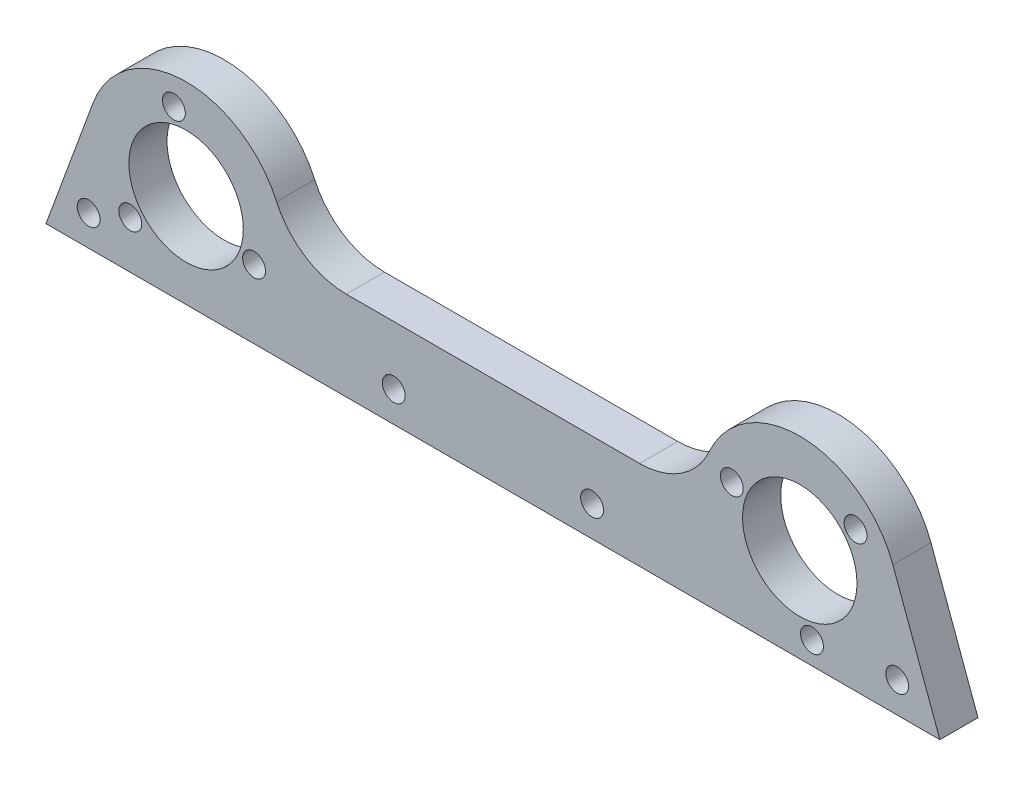
ISO-10303-21;
HEADER;
FILE_DESCRIPTION(('STEP AP214'),'2;1');
FILE_NAME('part.step','',(''),(''),'','','');
FILE_SCHEMA(('AUTOMOTIVE_DESIGN { 1 0 10303 214 1 1 1 1 }'));
ENDSEC;
DATA;
#1=APPLICATION_CONTEXT('core data for automotive mechanical design processes');
#2=APPLICATION_PROTOCOL_DEFINITION('international standard','automotive_design',2000,#1);
#3=PRODUCT_CONTEXT('',#1,'mechanical');
#4=PRODUCT('Part','Part','',(#3));
#5=PRODUCT_RELATED_PRODUCT_CATEGORY('part','',(#4));
#6=PRODUCT_DEFINITION_FORMATION('','',#4);
#7=PRODUCT_DEFINITION_CONTEXT('part definition',#1,'design');
#8=PRODUCT_DEFINITION('design','',#6,#7);
#9=PRODUCT_DEFINITION_SHAPE('','',#8);
#10=(LENGTH_UNIT() NAMED_UNIT(*) SI_UNIT(.MILLI.,.METRE.));
#11=(NAMED_UNIT(*) PLANE_ANGLE_UNIT() SI_UNIT($,.RADIAN.));
#12=(NAMED_UNIT(*) SI_UNIT($,.STERADIAN.) SOLID_ANGLE_UNIT());
#13=UNCERTAINTY_MEASURE_WITH_UNIT(LENGTH_MEASURE(1.E-05),#10,'distance_accuracy_value','');
#14=(GEOMETRIC_REPRESENTATION_CONTEXT(3) GLOBAL_UNCERTAINTY_ASSIGNED_CONTEXT((#13)) GLOBAL_UNIT_ASSIGNED_CONTEXT((#10,
#11,#12)) REPRESENTATION_CONTEXT('',''));
#15=CARTESIAN_POINT('',(0.,0.,0.));
#16=DIRECTION('',(0.,0.,1.));
#17=DIRECTION('',(1.,0.,0.));
#18=AXIS2_PLACEMENT_3D('',#15,#16,#17);
#19=CARTESIAN_POINT('',(-18.3632322296883,0.,3.75));
#20=DIRECTION('',(0.938751597235836,-0.344594600490442,0.));
#21=DIRECTION('',(0.344594600490442,0.938751597235836,0.));
#22=AXIS2_PLACEMENT_3D('',#19,#20,#21);
#23=PLANE('',#22);
#24=DIRECTION('',(-0.344594600490442,-0.938751597235836,0.));
#25=VECTOR('',#24,1.);
#26=CARTESIAN_POINT('',(-18.3632322296883,0.,-1.25));
#27=LINE('',#26,#25);
#28=CARTESIAN_POINT('',(-12.2037707640659,16.7797298063758,-1.25));
#29=VERTEX_POINT('',#28);
#30=CARTESIAN_POINT('',(-18.3632322296883,0.,-1.25));
#31=VERTEX_POINT('',#30);
#32=EDGE_CURVE('E145',#29,#31,#27,.T.);
#33=ORIENTED_EDGE('',*,*,#32,.T.);
#34=DIRECTION('',(0.,0.,-1.));
#35=VECTOR('',#34,1.);
#36=CARTESIAN_POINT('',(-18.3632322296883,0.,3.75));
#37=LINE('',#36,#35);
#38=CARTESIAN_POINT('',(-18.3632322296883,0.,3.75));
#39=VERTEX_POINT('',#38);
#40=EDGE_CURVE('E158',#39,#31,#37,.T.);
#41=ORIENTED_EDGE('',*,*,#40,.F.);
#42=DIRECTION('',(-0.344594600490442,-0.938751597235836,0.));
#43=VECTOR('',#42,1.);
#44=CARTESIAN_POINT('',(-18.3632322296883,0.,3.75));
#45=LINE('',#44,#43);
#46=CARTESIAN_POINT('',(-12.2037707640659,16.7797298063758,3.75));
#47=VERTEX_POINT('',#46);
#48=EDGE_CURVE('E107',#47,#39,#45,.T.);
#49=ORIENTED_EDGE('',*,*,#48,.F.);
#50=DIRECTION('',(0.,0.,-1.));
#51=VECTOR('',#50,1.);
#52=CARTESIAN_POINT('',(-12.2037707640659,16.7797298063758,3.75));
#53=LINE('',#52,#51);
#54=EDGE_CURVE('E151',#47,#29,#53,.T.);
#55=ORIENTED_EDGE('',*,*,#54,.T.);
#56=EDGE_LOOP('',(#33,#41,#49,#55));
#57=FACE_BOUND('',#56,.T.);
#58=ADVANCED_FACE('F35',(#57),#23,.F.);
#59=CARTESIAN_POINT('',(-18.3632322296883,0.,3.75));
#60=DIRECTION('',(0.,1.,0.));
#61=DIRECTION('',(0.,0.,1.));
#62=AXIS2_PLACEMENT_3D('',#59,#60,#61);
#63=PLANE('',#62);
#64=DIRECTION('',(0.,0.,-1.));
#65=VECTOR('',#64,1.);
#66=CARTESIAN_POINT('',(98.8132322296883,0.,3.75));
#67=LINE('',#66,#65);
#68=CARTESIAN_POINT('',(98.8132322296883,0.,3.75));
#69=VERTEX_POINT('',#68);
#70=CARTESIAN_POINT('',(98.8132322296883,0.,-1.25));
#71=VERTEX_POINT('',#70);
#72=EDGE_CURVE('E114',#69,#71,#67,.T.);
#73=ORIENTED_EDGE('',*,*,#72,.F.);
#74=DIRECTION('',(1.,0.,0.));
#75=VECTOR('',#74,1.);
#76=CARTESIAN_POINT('',(-18.3632322296883,0.,3.75));
#77=LINE('',#76,#75);
#78=EDGE_CURVE('E99',#39,#69,#77,.T.);
#79=ORIENTED_EDGE('',*,*,#78,.F.);
#80=ORIENTED_EDGE('',*,*,#40,.T.);
#81=DIRECTION('',(1.,0.,0.));
#82=VECTOR('',#81,1.);
#83=CARTESIAN_POINT('',(-18.3632322296883,0.,-1.25));
#84=LINE('',#83,#82);
#85=EDGE_CURVE('E116',#31,#71,#84,.T.);
#86=ORIENTED_EDGE('',*,*,#85,.T.);
#87=EDGE_LOOP('',(#73,#79,#80,#86));
#88=FACE_BOUND('',#87,.T.);
#89=ADVANCED_FACE('F115',(#88),#63,.F.);
#90=CARTESIAN_POINT('',(0.,12.3,3.75));
#91=DIRECTION('',(0.,0.,-1.));
#92=DIRECTION('',(-1.,0.,0.));
#93=AXIS2_PLACEMENT_3D('',#90,#91,#92);
#94=CYLINDRICAL_SURFACE('',#93,13.);
#95=CARTESIAN_POINT('',(0.,12.3,3.75));
#96=DIRECTION('',(0.,0.,1.));
#97=DIRECTION('',(1.,0.,0.));
#98=AXIS2_PLACEMENT_3D('',#95,#96,#97);
#99=CIRCLE('',#98,13.);
#100=CARTESIAN_POINT('',(11.8684813075359,17.604634902863,3.75));
#101=VERTEX_POINT('',#100);
#102=EDGE_CURVE('E111',#101,#47,#99,.T.);
#103=ORIENTED_EDGE('',*,*,#102,.F.);
#104=DIRECTION('',(0.,0.,-1.));
#105=VECTOR('',#104,1.);
#106=CARTESIAN_POINT('',(11.8684813075359,17.604634902863,3.75));
#107=LINE('',#106,#105);
#108=CARTESIAN_POINT('',(11.8684813075359,17.604634902863,-1.25));
#109=VERTEX_POINT('',#108);
#110=EDGE_CURVE('E160',#101,#109,#107,.T.);
#111=ORIENTED_EDGE('',*,*,#110,.T.);
#112=CARTESIAN_POINT('',(0.,12.3,-1.25));
#113=DIRECTION('',(0.,0.,1.));
#114=DIRECTION('',(1.,0.,0.));
#115=AXIS2_PLACEMENT_3D('',#112,#113,#114);
#116=CIRCLE('',#115,13.);
#117=EDGE_CURVE('E148',#109,#29,#116,.T.);
#118=ORIENTED_EDGE('',*,*,#117,.T.);
#119=ORIENTED_EDGE('',*,*,#54,.F.);
#120=EDGE_LOOP('',(#103,#111,#118,#119));
#121=FACE_BOUND('',#120,.T.);
#122=ADVANCED_FACE('F180',(#121),#94,.T.);
#123=CARTESIAN_POINT('',(0.,12.3,3.75));
#124=DIRECTION('',(0.,0.,1.));
#125=DIRECTION('',(1.,0.,0.));
#126=AXIS2_PLACEMENT_3D('',#123,#124,#125);
#127=PLANE('',#126);
#128=CARTESIAN_POINT('',(93.225,3.99999999999998,3.75));
#129=DIRECTION('',(0.,0.,-1.));
#130=DIRECTION('',(-1.,0.,0.));
#131=AXIS2_PLACEMENT_3D('',#128,#129,#130);
#132=CIRCLE('',#131,1.5);
#133=CARTESIAN_POINT('',(91.725,3.99999999999998,3.75));
#134=VERTEX_POINT('',#133);
#135=EDGE_CURVE('E383',#134,#134,#132,.T.);
#136=ORIENTED_EDGE('',*,*,#135,.T.);
#137=EDGE_LOOP('',(#136));
#138=FACE_BOUND('',#137,.T.);
#139=CARTESIAN_POINT('',(27.225,3.99999999999998,3.75));
#140=DIRECTION('',(0.,0.,-1.));
#141=DIRECTION('',(1.,0.,0.));
#142=AXIS2_PLACEMENT_3D('',#139,#140,#141);
#143=CIRCLE('',#142,1.5);
#144=CARTESIAN_POINT('',(28.725,3.99999999999998,3.75));
#145=VERTEX_POINT('',#144);
#146=EDGE_CURVE('E395',#145,#145,#143,.T.);
#147=ORIENTED_EDGE('',*,*,#146,.T.);
#148=EDGE_LOOP('',(#147));
#149=FACE_BOUND('',#148,.T.);
#150=CARTESIAN_POINT('',(-12.775,3.99999999999999,3.75));
#151=DIRECTION('',(0.,0.,-1.));
#152=DIRECTION('',(1.,0.,0.));
#153=AXIS2_PLACEMENT_3D('',#150,#151,#152);
#154=CIRCLE('',#153,1.5);
#155=CARTESIAN_POINT('',(-11.275,3.99999999999999,3.75));
#156=VERTEX_POINT('',#155);
#157=EDGE_CURVE('E404',#156,#156,#154,.T.);
#158=ORIENTED_EDGE('',*,*,#157,.T.);
#159=EDGE_LOOP('',(#158));
#160=FACE_BOUND('',#159,.T.);
#161=CARTESIAN_POINT('',(53.225,3.99999999999998,3.75));
#162=DIRECTION('',(0.,0.,-1.));
#163=DIRECTION('',(-1.,0.,0.));
#164=AXIS2_PLACEMENT_3D('',#161,#162,#163);
#165=CIRCLE('',#164,1.5);
#166=CARTESIAN_POINT('',(51.725,3.99999999999998,3.75));
#167=VERTEX_POINT('',#166);
#168=EDGE_CURVE('E387',#167,#167,#165,.T.);
#169=ORIENTED_EDGE('',*,*,#168,.T.);
#170=EDGE_LOOP('',(#169));
#171=FACE_BOUND('',#170,.T.);
#172=CARTESIAN_POINT('',(-1.59841444419239,21.6645646596407,3.75));
#173=DIRECTION('',(0.,0.,-1.));
#174=DIRECTION('',(-1.,0.,0.));
#175=AXIS2_PLACEMENT_3D('',#172,#173,#174);
#176=CIRCLE('',#175,1.5);
#177=CARTESIAN_POINT('',(-3.09841444419239,21.6645646596407,3.75));
#178=VERTEX_POINT('',#177);
#179=EDGE_CURVE('E409',#178,#178,#176,.T.);
#180=ORIENTED_EDGE('',*,*,#179,.T.);
#181=EDGE_LOOP('',(#180));
#182=FACE_BOUND('',#181,.T.);
#183=CARTESIAN_POINT('',(-7.31074366853484,6.23345015573269,3.75));
#184=DIRECTION('',(0.,0.,-1.));
#185=DIRECTION('',(-1.,0.,0.));
#186=AXIS2_PLACEMENT_3D('',#183,#184,#185);
#187=CIRCLE('',#186,1.5);
#188=CARTESIAN_POINT('',(-8.81074366853484,6.23345015573269,3.75));
#189=VERTEX_POINT('',#188);
#190=EDGE_CURVE('E415',#189,#189,#187,.T.);
#191=ORIENTED_EDGE('',*,*,#190,.T.);
#192=EDGE_LOOP('',(#191));
#193=FACE_BOUND('',#192,.T.);
#194=CARTESIAN_POINT('',(8.90915811272735,9.00198518462588,3.75));
#195=DIRECTION('',(0.,0.,-1.));
#196=DIRECTION('',(-1.,0.,0.));
#197=AXIS2_PLACEMENT_3D('',#194,#195,#196);
#198=CIRCLE('',#197,1.5);
#199=CARTESIAN_POINT('',(7.40915811272735,9.00198518462588,3.75));
#200=VERTEX_POINT('',#199);
#201=EDGE_CURVE('E421',#200,#200,#198,.T.);
#202=ORIENTED_EDGE('',*,*,#201,.T.);
#203=EDGE_LOOP('',(#202));
#204=FACE_BOUND('',#203,.T.);
#205=CARTESIAN_POINT('',(71.5408418872726,15.5980148153741,3.75));
#206=DIRECTION('',(0.,0.,-1.));
#207=DIRECTION('',(-1.,0.,0.));
#208=AXIS2_PLACEMENT_3D('',#205,#206,#207);
#209=CIRCLE('',#208,1.5);
#210=CARTESIAN_POINT('',(70.0408418872726,15.5980148153741,3.75));
#211=VERTEX_POINT('',#210);
#212=EDGE_CURVE('E427',#211,#211,#209,.T.);
#213=ORIENTED_EDGE('',*,*,#212,.T.);
#214=EDGE_LOOP('',(#213));
#215=FACE_BOUND('',#214,.T.);
#216=CARTESIAN_POINT('',(82.0484144441923,2.93543534035925,3.75));
#217=DIRECTION('',(0.,0.,-1.));
#218=DIRECTION('',(-1.,0.,0.));
#219=AXIS2_PLACEMENT_3D('',#216,#217,#218);
#220=CIRCLE('',#219,1.5);
#221=CARTESIAN_POINT('',(80.5484144441923,2.93543534035925,3.75));
#222=VERTEX_POINT('',#221);
#223=EDGE_CURVE('E433',#222,#222,#220,.T.);
#224=ORIENTED_EDGE('',*,*,#223,.T.);
#225=EDGE_LOOP('',(#224));
#226=FACE_BOUND('',#225,.T.);
#227=CARTESIAN_POINT('',(87.7607436685348,18.3665498442673,3.75));
#228=DIRECTION('',(0.,0.,-1.));
#229=DIRECTION('',(-1.,0.,0.));
#230=AXIS2_PLACEMENT_3D('',#227,#228,#229);
#231=CIRCLE('',#230,1.5);
#232=CARTESIAN_POINT('',(86.2607436685348,18.3665498442673,3.75));
#233=VERTEX_POINT('',#232);
#234=EDGE_CURVE('E439',#233,#233,#231,.T.);
#235=ORIENTED_EDGE('',*,*,#234,.T.);
#236=EDGE_LOOP('',(#235));
#237=FACE_BOUND('',#236,.T.);
#238=CARTESIAN_POINT('',(80.45,12.3,3.75));
#239=DIRECTION('',(0.,0.,1.));
#240=DIRECTION('',(1.,0.,0.));
#241=AXIS2_PLACEMENT_3D('',#238,#239,#240);
#242=CIRCLE('',#241,13.);
#243=CARTESIAN_POINT('',(92.6537707640659,16.7797298063758,3.75));
#244=VERTEX_POINT('',#243);
#245=CARTESIAN_POINT('',(68.5815186924641,17.604634902863,3.75));
#246=VERTEX_POINT('',#245);
#247=EDGE_CURVE('E124',#244,#246,#242,.T.);
#248=ORIENTED_EDGE('',*,*,#247,.T.);
#249=CARTESIAN_POINT('',(59.4519176866673,21.6851232896806,3.75));
#250=DIRECTION('',(0.,0.,1.));
#251=DIRECTION('',(1.,0.,0.));
#252=AXIS2_PLACEMENT_3D('',#249,#250,#251);
#253=CIRCLE('',#252,10.);
#254=CARTESIAN_POINT('',(59.4519176866673,11.6851232896806,3.75));
#255=VERTEX_POINT('',#254);
#256=EDGE_CURVE('E11',#246,#255,#253,.F.);
#257=ORIENTED_EDGE('',*,*,#256,.T.);
#258=DIRECTION('',(1.,0.,0.));
#259=VECTOR('',#258,1.);
#260=CARTESIAN_POINT('',(14.0738862476995,11.6851232896806,3.75));
#261=LINE('',#260,#259);
#262=CARTESIAN_POINT('',(20.9980823133327,11.6851232896806,3.75));
#263=VERTEX_POINT('',#262);
#264=EDGE_CURVE('E138',#263,#255,#261,.T.);
#265=ORIENTED_EDGE('',*,*,#264,.F.);
#266=CARTESIAN_POINT('',(20.9980823133327,21.6851232896806,3.75));
#267=DIRECTION('',(0.,0.,1.));
#268=DIRECTION('',(1.,0.,0.));
#269=AXIS2_PLACEMENT_3D('',#266,#267,#268);
#270=CIRCLE('',#269,10.);
#271=EDGE_CURVE('E171',#263,#101,#270,.F.);
#272=ORIENTED_EDGE('',*,*,#271,.T.);
#273=ORIENTED_EDGE('',*,*,#102,.T.);
#274=ORIENTED_EDGE('',*,*,#48,.T.);
#275=ORIENTED_EDGE('',*,*,#78,.T.);
#276=DIRECTION('',(-0.344594600490442,0.938751597235836,0.));
#277=VECTOR('',#276,1.);
#278=CARTESIAN_POINT('',(92.6537707640659,16.7797298063758,3.75));
#279=LINE('',#278,#277);
#280=EDGE_CURVE('E104',#69,#244,#279,.T.);
#281=ORIENTED_EDGE('',*,*,#280,.T.);
#282=EDGE_LOOP('',(#248,#257,#265,#272,#273,#274,#275,#281));
#283=FACE_BOUND('',#282,.T.);
#284=CARTESIAN_POINT('',(80.45,12.3,3.75));
#285=DIRECTION('',(0.,0.,1.));
#286=DIRECTION('',(1.,0.,0.));
#287=AXIS2_PLACEMENT_3D('',#284,#285,#286);
#288=CIRCLE('',#287,7.5);
#289=CARTESIAN_POINT('',(87.95,12.3,3.75));
#290=VERTEX_POINT('',#289);
#291=EDGE_CURVE('E131',#290,#290,#288,.T.);
#292=ORIENTED_EDGE('',*,*,#291,.F.);
#293=EDGE_LOOP('',(#292));
#294=FACE_BOUND('',#293,.T.);
#295=CARTESIAN_POINT('',(0.,12.3,3.75));
#296=DIRECTION('',(0.,0.,1.));
#297=DIRECTION('',(1.,0.,0.));
#298=AXIS2_PLACEMENT_3D('',#295,#296,#297);
#299=CIRCLE('',#298,7.5);
#300=CARTESIAN_POINT('',(7.5,12.3,3.75));
#301=VERTEX_POINT('',#300);
#302=EDGE_CURVE('E141',#301,#301,#299,.T.);
#303=ORIENTED_EDGE('',*,*,#302,.F.);
#304=EDGE_LOOP('',(#303));
#305=FACE_BOUND('',#304,.T.);
#306=ADVANCED_FACE('F101',(#138,#149,#160,#171,#182,#193,#204,#215,#226,#237,#283,#294,#305),
#127,.T.);
#307=CARTESIAN_POINT('',(0.,12.3,-1.25));
#308=DIRECTION('',(0.,0.,1.));
#309=DIRECTION('',(1.,0.,0.));
#310=AXIS2_PLACEMENT_3D('',#307,#308,#309);
#311=PLANE('',#310);
#312=CARTESIAN_POINT('',(93.225,3.99999999999998,-1.25));
#313=DIRECTION('',(0.,0.,-1.));
#314=DIRECTION('',(-1.,0.,0.));
#315=AXIS2_PLACEMENT_3D('',#312,#313,#314);
#316=CIRCLE('',#315,1.5);
#317=CARTESIAN_POINT('',(91.725,3.99999999999998,-1.25));
#318=VERTEX_POINT('',#317);
#319=EDGE_CURVE('E386',#318,#318,#316,.T.);
#320=ORIENTED_EDGE('',*,*,#319,.F.);
#321=EDGE_LOOP('',(#320));
#322=FACE_BOUND('',#321,.T.);
#323=CARTESIAN_POINT('',(27.225,3.99999999999998,-1.25));
#324=DIRECTION('',(0.,0.,-1.));
#325=DIRECTION('',(1.,0.,0.));
#326=AXIS2_PLACEMENT_3D('',#323,#324,#325);
#327=CIRCLE('',#326,1.5);
#328=CARTESIAN_POINT('',(28.725,3.99999999999998,-1.25));
#329=VERTEX_POINT('',#328);
#330=EDGE_CURVE('E399',#329,#329,#327,.T.);
#331=ORIENTED_EDGE('',*,*,#330,.F.);
#332=EDGE_LOOP('',(#331));
#333=FACE_BOUND('',#332,.T.);
#334=CARTESIAN_POINT('',(-12.775,3.99999999999999,-1.25));
#335=DIRECTION('',(0.,0.,-1.));
#336=DIRECTION('',(1.,0.,0.));
#337=AXIS2_PLACEMENT_3D('',#334,#335,#336);
#338=CIRCLE('',#337,1.5);
#339=CARTESIAN_POINT('',(-11.275,3.99999999999999,-1.25));
#340=VERTEX_POINT('',#339);
#341=EDGE_CURVE('E398',#340,#340,#338,.T.);
#342=ORIENTED_EDGE('',*,*,#341,.F.);
#343=EDGE_LOOP('',(#342));
#344=FACE_BOUND('',#343,.T.);
#345=CARTESIAN_POINT('',(53.225,3.99999999999998,-1.25));
#346=DIRECTION('',(0.,0.,-1.));
#347=DIRECTION('',(-1.,0.,0.));
#348=AXIS2_PLACEMENT_3D('',#345,#346,#347);
#349=CIRCLE('',#348,1.5);
#350=CARTESIAN_POINT('',(51.725,3.99999999999998,-1.25));
#351=VERTEX_POINT('',#350);
#352=EDGE_CURVE('E392',#351,#351,#349,.T.);
#353=ORIENTED_EDGE('',*,*,#352,.F.);
#354=EDGE_LOOP('',(#353));
#355=FACE_BOUND('',#354,.T.);
#356=CARTESIAN_POINT('',(-1.59841444419239,21.6645646596407,-1.25));
#357=DIRECTION('',(0.,0.,-1.));
#358=DIRECTION('',(-1.,0.,0.));
#359=AXIS2_PLACEMENT_3D('',#356,#357,#358);
#360=CIRCLE('',#359,1.5);
#361=CARTESIAN_POINT('',(-3.09841444419239,21.6645646596407,-1.25));
#362=VERTEX_POINT('',#361);
#363=EDGE_CURVE('E412',#362,#362,#360,.T.);
#364=ORIENTED_EDGE('',*,*,#363,.F.);
#365=EDGE_LOOP('',(#364));
#366=FACE_BOUND('',#365,.T.);
#367=CARTESIAN_POINT('',(-7.31074366853484,6.23345015573269,-1.25));
#368=DIRECTION('',(0.,0.,-1.));
#369=DIRECTION('',(-1.,0.,0.));
#370=AXIS2_PLACEMENT_3D('',#367,#368,#369);
#371=CIRCLE('',#370,1.5);
#372=CARTESIAN_POINT('',(-8.81074366853484,6.23345015573269,-1.25));
#373=VERTEX_POINT('',#372);
#374=EDGE_CURVE('E418',#373,#373,#371,.T.);
#375=ORIENTED_EDGE('',*,*,#374,.F.);
#376=EDGE_LOOP('',(#375));
#377=FACE_BOUND('',#376,.T.);
#378=CARTESIAN_POINT('',(8.90915811272735,9.00198518462588,-1.25));
#379=DIRECTION('',(0.,0.,-1.));
#380=DIRECTION('',(-1.,0.,0.));
#381=AXIS2_PLACEMENT_3D('',#378,#379,#380);
#382=CIRCLE('',#381,1.5);
#383=CARTESIAN_POINT('',(7.40915811272735,9.00198518462588,-1.25));
#384=VERTEX_POINT('',#383);
#385=EDGE_CURVE('E424',#384,#384,#382,.T.);
#386=ORIENTED_EDGE('',*,*,#385,.F.);
#387=EDGE_LOOP('',(#386));
#388=FACE_BOUND('',#387,.T.);
#389=CARTESIAN_POINT('',(71.5408418872726,15.5980148153741,-1.25));
#390=DIRECTION('',(0.,0.,-1.));
#391=DIRECTION('',(-1.,0.,0.));
#392=AXIS2_PLACEMENT_3D('',#389,#390,#391);
#393=CIRCLE('',#392,1.5);
#394=CARTESIAN_POINT('',(70.0408418872726,15.5980148153741,-1.25));
#395=VERTEX_POINT('',#394);
#396=EDGE_CURVE('E430',#395,#395,#393,.T.);
#397=ORIENTED_EDGE('',*,*,#396,.F.);
#398=EDGE_LOOP('',(#397));
#399=FACE_BOUND('',#398,.T.);
#400=CARTESIAN_POINT('',(82.0484144441923,2.93543534035925,-1.25));
#401=DIRECTION('',(0.,0.,-1.));
#402=DIRECTION('',(-1.,0.,0.));
#403=AXIS2_PLACEMENT_3D('',#400,#401,#402);
#404=CIRCLE('',#403,1.5);
#405=CARTESIAN_POINT('',(80.5484144441923,2.93543534035925,-1.25));
#406=VERTEX_POINT('',#405);
#407=EDGE_CURVE('E436',#406,#406,#404,.T.);
#408=ORIENTED_EDGE('',*,*,#407,.F.);
#409=EDGE_LOOP('',(#408));
#410=FACE_BOUND('',#409,.T.);
#411=CARTESIAN_POINT('',(87.7607436685348,18.3665498442673,-1.25));
#412=DIRECTION('',(0.,0.,-1.));
#413=DIRECTION('',(-1.,0.,0.));
#414=AXIS2_PLACEMENT_3D('',#411,#412,#413);
#415=CIRCLE('',#414,1.5);
#416=CARTESIAN_POINT('',(86.2607436685348,18.3665498442673,-1.25));
#417=VERTEX_POINT('',#416);
#418=EDGE_CURVE('E389',#417,#417,#415,.T.);
#419=ORIENTED_EDGE('',*,*,#418,.F.);
#420=EDGE_LOOP('',(#419));
#421=FACE_BOUND('',#420,.T.);
#422=DIRECTION('',(-0.344594600490442,0.938751597235836,0.));
#423=VECTOR('',#422,1.);
#424=CARTESIAN_POINT('',(92.6537707640659,16.7797298063758,-1.25));
#425=LINE('',#424,#423);
#426=CARTESIAN_POINT('',(92.6537707640659,16.7797298063758,-1.25));
#427=VERTEX_POINT('',#426);
#428=EDGE_CURVE('E128',#71,#427,#425,.T.);
#429=ORIENTED_EDGE('',*,*,#428,.F.);
#430=ORIENTED_EDGE('',*,*,#85,.F.);
#431=ORIENTED_EDGE('',*,*,#32,.F.);
#432=ORIENTED_EDGE('',*,*,#117,.F.);
#433=CARTESIAN_POINT('',(20.9980823133327,21.6851232896806,-1.25));
#434=DIRECTION('',(0.,0.,1.));
#435=DIRECTION('',(1.,0.,0.));
#436=AXIS2_PLACEMENT_3D('',#433,#434,#435);
#437=CIRCLE('',#436,10.);
#438=CARTESIAN_POINT('',(20.9980823133327,11.6851232896806,-1.25));
#439=VERTEX_POINT('',#438);
#440=EDGE_CURVE('E169',#109,#439,#437,.T.);
#441=ORIENTED_EDGE('',*,*,#440,.T.);
#442=DIRECTION('',(1.,0.,0.));
#443=VECTOR('',#442,1.);
#444=CARTESIAN_POINT('',(14.0738862476995,11.6851232896806,-1.25));
#445=LINE('',#444,#443);
#446=CARTESIAN_POINT('',(59.4519176866673,11.6851232896806,-1.25));
#447=VERTEX_POINT('',#446);
#448=EDGE_CURVE('E119',#439,#447,#445,.T.);
#449=ORIENTED_EDGE('',*,*,#448,.T.);
#450=CARTESIAN_POINT('',(59.4519176866673,21.6851232896806,-1.25));
#451=DIRECTION('',(0.,0.,1.));
#452=DIRECTION('',(1.,0.,0.));
#453=AXIS2_PLACEMENT_3D('',#450,#451,#452);
#454=CIRCLE('',#453,10.);
#455=CARTESIAN_POINT('',(68.5815186924641,17.604634902863,-1.25));
#456=VERTEX_POINT('',#455);
#457=EDGE_CURVE('E43',#447,#456,#454,.T.);
#458=ORIENTED_EDGE('',*,*,#457,.T.);
#459=CARTESIAN_POINT('',(80.45,12.3,-1.25));
#460=DIRECTION('',(0.,0.,1.));
#461=DIRECTION('',(1.,0.,0.));
#462=AXIS2_PLACEMENT_3D('',#459,#460,#461);
#463=CIRCLE('',#462,13.);
#464=EDGE_CURVE('E125',#427,#456,#463,.T.);
#465=ORIENTED_EDGE('',*,*,#464,.F.);
#466=EDGE_LOOP('',(#429,#430,#431,#432,#441,#449,#458,#465));
#467=FACE_BOUND('',#466,.T.);
#468=CARTESIAN_POINT('',(80.45,12.3,-1.25));
#469=DIRECTION('',(0.,0.,1.));
#470=DIRECTION('',(1.,0.,0.));
#471=AXIS2_PLACEMENT_3D('',#468,#469,#470);
#472=CIRCLE('',#471,7.5);
#473=CARTESIAN_POINT('',(87.95,12.3,-1.25));
#474=VERTEX_POINT('',#473);
#475=EDGE_CURVE('E134',#474,#474,#472,.T.);
#476=ORIENTED_EDGE('',*,*,#475,.T.);
#477=EDGE_LOOP('',(#476));
#478=FACE_BOUND('',#477,.T.);
#479=CARTESIAN_POINT('',(0.,12.3,-1.25));
#480=DIRECTION('',(0.,0.,1.));
#481=DIRECTION('',(1.,0.,0.));
#482=AXIS2_PLACEMENT_3D('',#479,#480,#481);
#483=CIRCLE('',#482,7.5);
#484=CARTESIAN_POINT('',(7.5,12.3,-1.25));
#485=VERTEX_POINT('',#484);
#486=EDGE_CURVE('E142',#485,#485,#483,.T.);
#487=ORIENTED_EDGE('',*,*,#486,.T.);
#488=EDGE_LOOP('',(#487));
#489=FACE_BOUND('',#488,.T.);
#490=ADVANCED_FACE('F184',(#322,#333,#344,#355,#366,#377,#388,#399,#410,#421,#467,#478,#489),
#311,.F.);
#491=CARTESIAN_POINT('',(0.,12.3,-1.25));
#492=DIRECTION('',(0.,0.,1.));
#493=DIRECTION('',(1.,0.,0.));
#494=AXIS2_PLACEMENT_3D('',#491,#492,#493);
#495=CYLINDRICAL_SURFACE('',#494,7.5);
#496=ORIENTED_EDGE('',*,*,#486,.F.);
#497=EDGE_LOOP('',(#496));
#498=FACE_BOUND('',#497,.T.);
#499=ORIENTED_EDGE('',*,*,#302,.T.);
#500=EDGE_LOOP('',(#499));
#501=FACE_BOUND('',#500,.T.);
#502=ADVANCED_FACE('F223',(#498,#501),#495,.F.);
#503=CARTESIAN_POINT('',(14.0738862476995,11.6851232896806,57.3416514789204));
#504=DIRECTION('',(0.,1.,0.));
#505=DIRECTION('',(-1.,0.,0.));
#506=AXIS2_PLACEMENT_3D('',#503,#504,#505);
#507=PLANE('',#506);
#508=ORIENTED_EDGE('',*,*,#448,.F.);
#509=DIRECTION('',(0.,0.,-1.));
#510=VECTOR('',#509,1.);
#511=CARTESIAN_POINT('',(20.9980823133327,11.6851232896806,57.3416514789204));
#512=LINE('',#511,#510);
#513=EDGE_CURVE('E166',#439,#263,#512,.F.);
#514=ORIENTED_EDGE('',*,*,#513,.T.);
#515=ORIENTED_EDGE('',*,*,#264,.T.);
#516=DIRECTION('',(0.,0.,-1.));
#517=VECTOR('',#516,1.);
#518=CARTESIAN_POINT('',(59.4519176866673,11.6851232896806,57.3416514789204));
#519=LINE('',#518,#517);
#520=EDGE_CURVE('E163',#255,#447,#519,.T.);
#521=ORIENTED_EDGE('',*,*,#520,.T.);
#522=EDGE_LOOP('',(#508,#514,#515,#521));
#523=FACE_BOUND('',#522,.T.);
#524=ADVANCED_FACE('F188',(#523),#507,.T.);
#525=CARTESIAN_POINT('',(92.6537707640659,16.7797298063758,3.75));
#526=DIRECTION('',(-0.938751597235836,-0.344594600490442,0.));
#527=DIRECTION('',(0.344594600490442,-0.938751597235836,0.));
#528=AXIS2_PLACEMENT_3D('',#525,#526,#527);
#529=PLANE('',#528);
#530=ORIENTED_EDGE('',*,*,#428,.T.);
#531=DIRECTION('',(0.,0.,-1.));
#532=VECTOR('',#531,1.);
#533=CARTESIAN_POINT('',(92.6537707640659,16.7797298063758,3.75));
#534=LINE('',#533,#532);
#535=EDGE_CURVE('E120',#244,#427,#534,.T.);
#536=ORIENTED_EDGE('',*,*,#535,.F.);
#537=ORIENTED_EDGE('',*,*,#280,.F.);
#538=ORIENTED_EDGE('',*,*,#72,.T.);
#539=EDGE_LOOP('',(#530,#536,#537,#538));
#540=FACE_BOUND('',#539,.T.);
#541=ADVANCED_FACE('F122',(#540),#529,.F.);
#542=CARTESIAN_POINT('',(80.45,12.3,3.75));
#543=DIRECTION('',(0.,0.,-1.));
#544=DIRECTION('',(-1.,0.,0.));
#545=AXIS2_PLACEMENT_3D('',#542,#543,#544);
#546=CYLINDRICAL_SURFACE('',#545,13.);
#547=ORIENTED_EDGE('',*,*,#464,.T.);
#548=DIRECTION('',(0.,0.,-1.));
#549=VECTOR('',#548,1.);
#550=CARTESIAN_POINT('',(68.5815186924641,17.604634902863,3.75));
#551=LINE('',#550,#549);
#552=EDGE_CURVE('E50',#456,#246,#551,.F.);
#553=ORIENTED_EDGE('',*,*,#552,.T.);
#554=ORIENTED_EDGE('',*,*,#247,.F.);
#555=ORIENTED_EDGE('',*,*,#535,.T.);
#556=EDGE_LOOP('',(#547,#553,#554,#555));
#557=FACE_BOUND('',#556,.T.);
#558=ADVANCED_FACE('F192',(#557),#546,.T.);
#559=CARTESIAN_POINT('',(80.45,12.3,-1.25));
#560=DIRECTION('',(0.,0.,1.));
#561=DIRECTION('',(1.,0.,0.));
#562=AXIS2_PLACEMENT_3D('',#559,#560,#561);
#563=CYLINDRICAL_SURFACE('',#562,7.5);
#564=ORIENTED_EDGE('',*,*,#475,.F.);
#565=EDGE_LOOP('',(#564));
#566=FACE_BOUND('',#565,.T.);
#567=ORIENTED_EDGE('',*,*,#291,.T.);
#568=EDGE_LOOP('',(#567));
#569=FACE_BOUND('',#568,.T.);
#570=ADVANCED_FACE('F202',(#566,#569),#563,.F.);
#571=CARTESIAN_POINT('',(20.9980823133327,21.6851232896806,3.75));
#572=DIRECTION('',(0.,0.,-1.));
#573=DIRECTION('',(-1.,0.,0.));
#574=AXIS2_PLACEMENT_3D('',#571,#572,#573);
#575=CYLINDRICAL_SURFACE('',#574,10.);
#576=ORIENTED_EDGE('',*,*,#271,.F.);
#577=ORIENTED_EDGE('',*,*,#513,.F.);
#578=ORIENTED_EDGE('',*,*,#440,.F.);
#579=ORIENTED_EDGE('',*,*,#110,.F.);
#580=EDGE_LOOP('',(#576,#577,#578,#579));
#581=FACE_BOUND('',#580,.T.);
#582=ADVANCED_FACE('F182',(#581),#575,.F.);
#583=CARTESIAN_POINT('',(59.4519176866673,21.6851232896806,3.75));
#584=DIRECTION('',(0.,0.,-1.));
#585=DIRECTION('',(-1.,0.,0.));
#586=AXIS2_PLACEMENT_3D('',#583,#584,#585);
#587=CYLINDRICAL_SURFACE('',#586,10.);
#588=ORIENTED_EDGE('',*,*,#256,.F.);
#589=ORIENTED_EDGE('',*,*,#552,.F.);
#590=ORIENTED_EDGE('',*,*,#457,.F.);
#591=ORIENTED_EDGE('',*,*,#520,.F.);
#592=EDGE_LOOP('',(#588,#589,#590,#591));
#593=FACE_BOUND('',#592,.T.);
#594=ADVANCED_FACE('F37',(#593),#587,.F.);
#595=CARTESIAN_POINT('',(87.7607436685348,18.3665498442673,3.75));
#596=DIRECTION('',(0.,0.,-1.));
#597=DIRECTION('',(-1.,0.,0.));
#598=AXIS2_PLACEMENT_3D('',#595,#596,#597);
#599=CYLINDRICAL_SURFACE('',#598,1.5);
#600=ORIENTED_EDGE('',*,*,#234,.F.);
#601=EDGE_LOOP('',(#600));
#602=FACE_BOUND('',#601,.T.);
#603=ORIENTED_EDGE('',*,*,#418,.T.);
#604=EDGE_LOOP('',(#603));
#605=FACE_BOUND('',#604,.T.);
#606=ADVANCED_FACE('F207',(#602,#605),#599,.F.);
#607=CARTESIAN_POINT('',(82.0484144441923,2.93543534035925,3.75));
#608=DIRECTION('',(0.,0.,-1.));
#609=DIRECTION('',(-1.,0.,0.));
#610=AXIS2_PLACEMENT_3D('',#607,#608,#609);
#611=CYLINDRICAL_SURFACE('',#610,1.5);
#612=ORIENTED_EDGE('',*,*,#223,.F.);
#613=EDGE_LOOP('',(#612));
#614=FACE_BOUND('',#613,.T.);
#615=ORIENTED_EDGE('',*,*,#407,.T.);
#616=EDGE_LOOP('',(#615));
#617=FACE_BOUND('',#616,.T.);
#618=ADVANCED_FACE('F290',(#614,#617),#611,.F.);
#619=CARTESIAN_POINT('',(71.5408418872726,15.5980148153741,3.75));
#620=DIRECTION('',(0.,0.,-1.));
#621=DIRECTION('',(-1.,0.,0.));
#622=AXIS2_PLACEMENT_3D('',#619,#620,#621);
#623=CYLINDRICAL_SURFACE('',#622,1.5);
#624=ORIENTED_EDGE('',*,*,#212,.F.);
#625=EDGE_LOOP('',(#624));
#626=FACE_BOUND('',#625,.T.);
#627=ORIENTED_EDGE('',*,*,#396,.T.);
#628=EDGE_LOOP('',(#627));
#629=FACE_BOUND('',#628,.T.);
#630=ADVANCED_FACE('F299',(#626,#629),#623,.F.);
#631=CARTESIAN_POINT('',(8.90915811272735,9.00198518462588,3.75));
#632=DIRECTION('',(0.,0.,-1.));
#633=DIRECTION('',(-1.,0.,0.));
#634=AXIS2_PLACEMENT_3D('',#631,#632,#633);
#635=CYLINDRICAL_SURFACE('',#634,1.5);
#636=ORIENTED_EDGE('',*,*,#201,.F.);
#637=EDGE_LOOP('',(#636));
#638=FACE_BOUND('',#637,.T.);
#639=ORIENTED_EDGE('',*,*,#385,.T.);
#640=EDGE_LOOP('',(#639));
#641=FACE_BOUND('',#640,.T.);
#642=ADVANCED_FACE('F308',(#638,#641),#635,.F.);
#643=CARTESIAN_POINT('',(-7.31074366853484,6.23345015573269,3.75));
#644=DIRECTION('',(0.,0.,-1.));
#645=DIRECTION('',(-1.,0.,0.));
#646=AXIS2_PLACEMENT_3D('',#643,#644,#645);
#647=CYLINDRICAL_SURFACE('',#646,1.5);
#648=ORIENTED_EDGE('',*,*,#190,.F.);
#649=EDGE_LOOP('',(#648));
#650=FACE_BOUND('',#649,.T.);
#651=ORIENTED_EDGE('',*,*,#374,.T.);
#652=EDGE_LOOP('',(#651));
#653=FACE_BOUND('',#652,.T.);
#654=ADVANCED_FACE('F318',(#650,#653),#647,.F.);
#655=CARTESIAN_POINT('',(-1.59841444419239,21.6645646596407,3.75));
#656=DIRECTION('',(0.,0.,-1.));
#657=DIRECTION('',(-1.,0.,0.));
#658=AXIS2_PLACEMENT_3D('',#655,#656,#657);
#659=CYLINDRICAL_SURFACE('',#658,1.5);
#660=ORIENTED_EDGE('',*,*,#179,.F.);
#661=EDGE_LOOP('',(#660));
#662=FACE_BOUND('',#661,.T.);
#663=ORIENTED_EDGE('',*,*,#363,.T.);
#664=EDGE_LOOP('',(#663));
#665=FACE_BOUND('',#664,.T.);
#666=ADVANCED_FACE('F327',(#662,#665),#659,.F.);
#667=CARTESIAN_POINT('',(53.225,3.99999999999998,3.75));
#668=DIRECTION('',(0.,0.,-1.));
#669=DIRECTION('',(-1.,0.,0.));
#670=AXIS2_PLACEMENT_3D('',#667,#668,#669);
#671=CYLINDRICAL_SURFACE('',#670,1.5);
#672=ORIENTED_EDGE('',*,*,#168,.F.);
#673=EDGE_LOOP('',(#672));
#674=FACE_BOUND('',#673,.T.);
#675=ORIENTED_EDGE('',*,*,#352,.T.);
#676=EDGE_LOOP('',(#675));
#677=FACE_BOUND('',#676,.T.);
#678=ADVANCED_FACE('F336',(#674,#677),#671,.F.);
#679=CARTESIAN_POINT('',(-12.775,3.99999999999999,3.75));
#680=DIRECTION('',(0.,0.,-1.));
#681=DIRECTION('',(-1.,0.,0.));
#682=AXIS2_PLACEMENT_3D('',#679,#680,#681);
#683=CYLINDRICAL_SURFACE('',#682,1.5);
#684=ORIENTED_EDGE('',*,*,#157,.F.);
#685=EDGE_LOOP('',(#684));
#686=FACE_BOUND('',#685,.T.);
#687=ORIENTED_EDGE('',*,*,#341,.T.);
#688=EDGE_LOOP('',(#687));
#689=FACE_BOUND('',#688,.T.);
#690=ADVANCED_FACE('F346',(#686,#689),#683,.F.);
#691=CARTESIAN_POINT('',(27.225,3.99999999999998,3.75));
#692=DIRECTION('',(0.,0.,-1.));
#693=DIRECTION('',(-1.,0.,0.));
#694=AXIS2_PLACEMENT_3D('',#691,#692,#693);
#695=CYLINDRICAL_SURFACE('',#694,1.5);
#696=ORIENTED_EDGE('',*,*,#146,.F.);
#697=EDGE_LOOP('',(#696));
#698=FACE_BOUND('',#697,.T.);
#699=ORIENTED_EDGE('',*,*,#330,.T.);
#700=EDGE_LOOP('',(#699));
#701=FACE_BOUND('',#700,.T.);
#702=ADVANCED_FACE('F353',(#698,#701),#695,.F.);
#703=CARTESIAN_POINT('',(93.225,3.99999999999998,3.75));
#704=DIRECTION('',(0.,0.,-1.));
#705=DIRECTION('',(-1.,0.,0.));
#706=AXIS2_PLACEMENT_3D('',#703,#704,#705);
#707=CYLINDRICAL_SURFACE('',#706,1.5);
#708=ORIENTED_EDGE('',*,*,#135,.F.);
#709=EDGE_LOOP('',(#708));
#710=FACE_BOUND('',#709,.T.);
#711=ORIENTED_EDGE('',*,*,#319,.T.);
#712=EDGE_LOOP('',(#711));
#713=FACE_BOUND('',#712,.T.);
#714=ADVANCED_FACE('F361',(#710,#713),#707,.F.);
#715=CLOSED_SHELL('',(#58,#89,#122,#306,#490,#502,#524,#541,#558,#570,#582,#594,#606,#618,#630,
#642,#654,#666,#678,#690,#702,#714));
#716=MANIFOLD_SOLID_BREP('B2',#715);
#717=ADVANCED_BREP_SHAPE_REPRESENTATION('',(#18,#716),#14);
#718=SHAPE_DEFINITION_REPRESENTATION(#9,#717);
ENDSEC;
END-ISO-10303-21;
